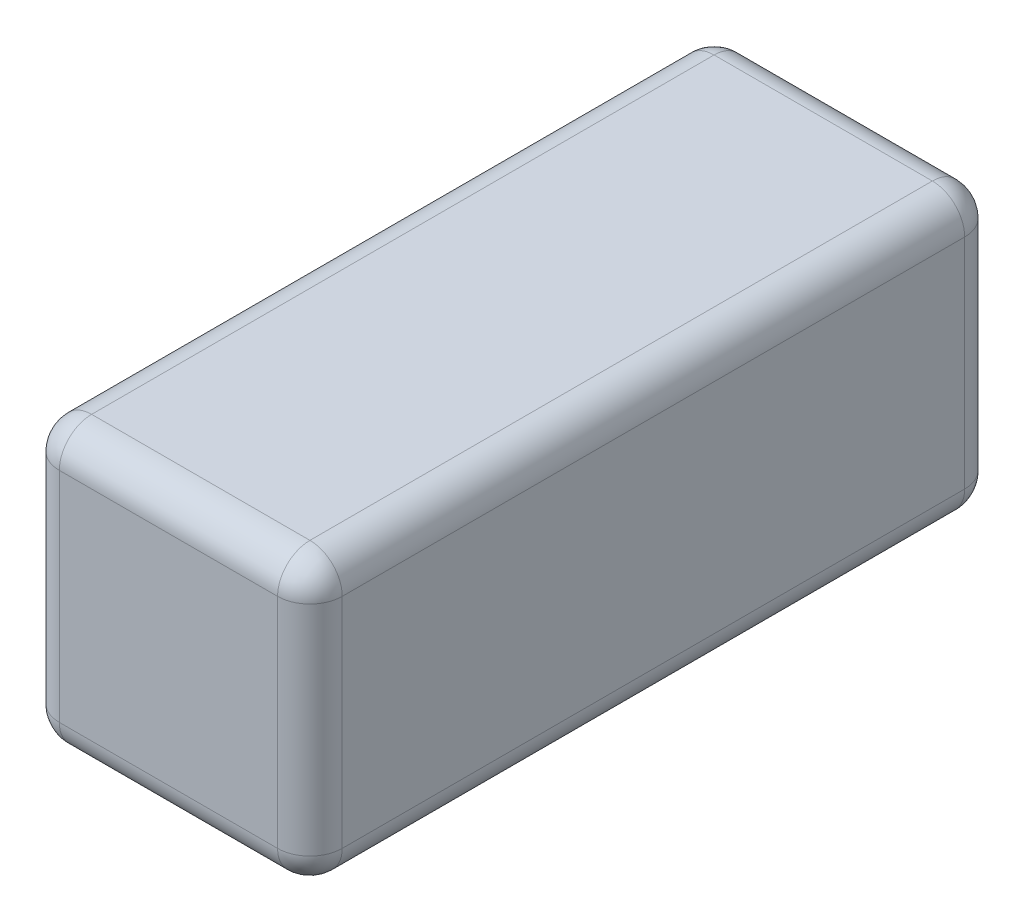
ISO-10303-21;
HEADER;
FILE_DESCRIPTION(('STEP AP214'),'2;1');
FILE_NAME('part.step','',(''),(''),'','','');
FILE_SCHEMA(('AUTOMOTIVE_DESIGN { 1 0 10303 214 1 1 1 1 }'));
ENDSEC;
DATA;
#1=APPLICATION_CONTEXT('core data for automotive mechanical design processes');
#2=APPLICATION_PROTOCOL_DEFINITION('international standard','automotive_design',2000,#1);
#3=PRODUCT_CONTEXT('',#1,'mechanical');
#4=PRODUCT('Part','Part','',(#3));
#5=PRODUCT_RELATED_PRODUCT_CATEGORY('part','',(#4));
#6=PRODUCT_DEFINITION_FORMATION('','',#4);
#7=PRODUCT_DEFINITION_CONTEXT('part definition',#1,'design');
#8=PRODUCT_DEFINITION('design','',#6,#7);
#9=PRODUCT_DEFINITION_SHAPE('','',#8);
#10=(LENGTH_UNIT() NAMED_UNIT(*) SI_UNIT(.MILLI.,.METRE.));
#11=(NAMED_UNIT(*) PLANE_ANGLE_UNIT() SI_UNIT($,.RADIAN.));
#12=(NAMED_UNIT(*) SI_UNIT($,.STERADIAN.) SOLID_ANGLE_UNIT());
#13=UNCERTAINTY_MEASURE_WITH_UNIT(LENGTH_MEASURE(1.E-05),#10,'distance_accuracy_value','');
#14=(GEOMETRIC_REPRESENTATION_CONTEXT(3) GLOBAL_UNCERTAINTY_ASSIGNED_CONTEXT((#13)) GLOBAL_UNIT_ASSIGNED_CONTEXT((#10,
#11,#12)) REPRESENTATION_CONTEXT('',''));
#15=CARTESIAN_POINT('',(0.,0.,0.));
#16=DIRECTION('',(0.,0.,1.));
#17=DIRECTION('',(1.,0.,0.));
#18=AXIS2_PLACEMENT_3D('',#15,#16,#17);
#19=CARTESIAN_POINT('',(35.,-35.,170.));
#20=DIRECTION('',(-1.,0.,0.));
#21=DIRECTION('',(0.,0.,1.));
#22=AXIS2_PLACEMENT_3D('',#19,#20,#21);
#23=PLANE('',#22);
#24=DIRECTION('',(0.,0.,-1.));
#25=VECTOR('',#24,1.);
#26=CARTESIAN_POINT('',(35.,27.,170.));
#27=LINE('',#26,#25);
#28=CARTESIAN_POINT('',(35.,27.,8.00000000000001));
#29=VERTEX_POINT('',#28);
#30=CARTESIAN_POINT('',(35.,27.,162.));
#31=VERTEX_POINT('',#30);
#32=EDGE_CURVE('E209',#29,#31,#27,.F.);
#33=ORIENTED_EDGE('',*,*,#32,.T.);
#34=DIRECTION('',(0.,1.,0.));
#35=VECTOR('',#34,1.);
#36=CARTESIAN_POINT('',(35.,-35.,162.));
#37=LINE('',#36,#35);
#38=CARTESIAN_POINT('',(35.,-27.,162.));
#39=VERTEX_POINT('',#38);
#40=EDGE_CURVE('E215',#31,#39,#37,.F.);
#41=ORIENTED_EDGE('',*,*,#40,.T.);
#42=DIRECTION('',(0.,0.,-1.));
#43=VECTOR('',#42,1.);
#44=CARTESIAN_POINT('',(35.,-27.,170.));
#45=LINE('',#44,#43);
#46=CARTESIAN_POINT('',(35.,-27.,8.00000000000001));
#47=VERTEX_POINT('',#46);
#48=EDGE_CURVE('E212',#39,#47,#45,.T.);
#49=ORIENTED_EDGE('',*,*,#48,.T.);
#50=DIRECTION('',(0.,1.,0.));
#51=VECTOR('',#50,1.);
#52=CARTESIAN_POINT('',(35.,35.,8.00000000000001));
#53=LINE('',#52,#51);
#54=EDGE_CURVE('E206',#47,#29,#53,.T.);
#55=ORIENTED_EDGE('',*,*,#54,.T.);
#56=EDGE_LOOP('',(#33,#41,#49,#55));
#57=FACE_BOUND('',#56,.T.);
#58=ADVANCED_FACE('F43',(#57),#23,.F.);
#59=CARTESIAN_POINT('',(-35.,35.,170.));
#60=DIRECTION('',(0.,-1.,0.));
#61=DIRECTION('',(0.,0.,-1.));
#62=AXIS2_PLACEMENT_3D('',#59,#60,#61);
#63=PLANE('',#62);
#64=DIRECTION('',(-1.,0.,0.));
#65=VECTOR('',#64,1.);
#66=CARTESIAN_POINT('',(-35.,35.,162.));
#67=LINE('',#66,#65);
#68=CARTESIAN_POINT('',(-27.,35.,162.));
#69=VERTEX_POINT('',#68);
#70=CARTESIAN_POINT('',(27.,35.,162.));
#71=VERTEX_POINT('',#70);
#72=EDGE_CURVE('E53',#69,#71,#67,.F.);
#73=ORIENTED_EDGE('',*,*,#72,.T.);
#74=DIRECTION('',(0.,0.,-1.));
#75=VECTOR('',#74,1.);
#76=CARTESIAN_POINT('',(27.,35.,170.));
#77=LINE('',#76,#75);
#78=CARTESIAN_POINT('',(27.,35.,8.00000000000001));
#79=VERTEX_POINT('',#78);
#80=EDGE_CURVE('E11',#71,#79,#77,.T.);
#81=ORIENTED_EDGE('',*,*,#80,.T.);
#82=DIRECTION('',(-1.,0.,0.));
#83=VECTOR('',#82,1.);
#84=CARTESIAN_POINT('',(-35.,35.,8.00000000000001));
#85=LINE('',#84,#83);
#86=CARTESIAN_POINT('',(-27.,35.,8.00000000000001));
#87=VERTEX_POINT('',#86);
#88=EDGE_CURVE('E232',#79,#87,#85,.T.);
#89=ORIENTED_EDGE('',*,*,#88,.T.);
#90=DIRECTION('',(0.,0.,-1.));
#91=VECTOR('',#90,1.);
#92=CARTESIAN_POINT('',(-27.,35.,170.));
#93=LINE('',#92,#91);
#94=EDGE_CURVE('E64',#87,#69,#93,.F.);
#95=ORIENTED_EDGE('',*,*,#94,.T.);
#96=EDGE_LOOP('',(#73,#81,#89,#95));
#97=FACE_BOUND('',#96,.T.);
#98=ADVANCED_FACE('F345',(#97),#63,.F.);
#99=CARTESIAN_POINT('',(-35.,-35.,170.));
#100=DIRECTION('',(1.,0.,0.));
#101=DIRECTION('',(0.,0.,-1.));
#102=AXIS2_PLACEMENT_3D('',#99,#100,#101);
#103=PLANE('',#102);
#104=DIRECTION('',(0.,-1.,0.));
#105=VECTOR('',#104,1.);
#106=CARTESIAN_POINT('',(-35.,-35.,8.00000000000001));
#107=LINE('',#106,#105);
#108=CARTESIAN_POINT('',(-35.,27.,8.00000000000001));
#109=VERTEX_POINT('',#108);
#110=CARTESIAN_POINT('',(-35.,-27.,8.00000000000001));
#111=VERTEX_POINT('',#110);
#112=EDGE_CURVE('E144',#109,#111,#107,.T.);
#113=ORIENTED_EDGE('',*,*,#112,.T.);
#114=DIRECTION('',(0.,0.,-1.));
#115=VECTOR('',#114,1.);
#116=CARTESIAN_POINT('',(-35.,-27.,170.));
#117=LINE('',#116,#115);
#118=CARTESIAN_POINT('',(-35.,-27.,162.));
#119=VERTEX_POINT('',#118);
#120=EDGE_CURVE('E139',#111,#119,#117,.F.);
#121=ORIENTED_EDGE('',*,*,#120,.T.);
#122=DIRECTION('',(0.,-1.,0.));
#123=VECTOR('',#122,1.);
#124=CARTESIAN_POINT('',(-35.,-35.,162.));
#125=LINE('',#124,#123);
#126=CARTESIAN_POINT('',(-35.,27.,162.));
#127=VERTEX_POINT('',#126);
#128=EDGE_CURVE('E131',#119,#127,#125,.F.);
#129=ORIENTED_EDGE('',*,*,#128,.T.);
#130=DIRECTION('',(0.,0.,-1.));
#131=VECTOR('',#130,1.);
#132=CARTESIAN_POINT('',(-35.,27.,170.));
#133=LINE('',#132,#131);
#134=EDGE_CURVE('E136',#127,#109,#133,.T.);
#135=ORIENTED_EDGE('',*,*,#134,.T.);
#136=EDGE_LOOP('',(#113,#121,#129,#135));
#137=FACE_BOUND('',#136,.T.);
#138=ADVANCED_FACE('F134',(#137),#103,.F.);
#139=CARTESIAN_POINT('',(-35.,-35.,170.));
#140=DIRECTION('',(0.,1.,0.));
#141=DIRECTION('',(0.,0.,1.));
#142=AXIS2_PLACEMENT_3D('',#139,#140,#141);
#143=PLANE('',#142);
#144=DIRECTION('',(1.,0.,0.));
#145=VECTOR('',#144,1.);
#146=CARTESIAN_POINT('',(-35.,-35.,162.));
#147=LINE('',#146,#145);
#148=CARTESIAN_POINT('',(27.,-35.,162.));
#149=VERTEX_POINT('',#148);
#150=CARTESIAN_POINT('',(-27.,-35.,162.));
#151=VERTEX_POINT('',#150);
#152=EDGE_CURVE('E225',#149,#151,#147,.F.);
#153=ORIENTED_EDGE('',*,*,#152,.T.);
#154=DIRECTION('',(0.,0.,-1.));
#155=VECTOR('',#154,1.);
#156=CARTESIAN_POINT('',(-27.,-35.,170.));
#157=LINE('',#156,#155);
#158=CARTESIAN_POINT('',(-27.,-35.,8.00000000000001));
#159=VERTEX_POINT('',#158);
#160=EDGE_CURVE('E228',#151,#159,#157,.T.);
#161=ORIENTED_EDGE('',*,*,#160,.T.);
#162=DIRECTION('',(1.,0.,0.));
#163=VECTOR('',#162,1.);
#164=CARTESIAN_POINT('',(35.,-35.,8.00000000000001));
#165=LINE('',#164,#163);
#166=CARTESIAN_POINT('',(27.,-35.,8.00000000000001));
#167=VERTEX_POINT('',#166);
#168=EDGE_CURVE('E219',#159,#167,#165,.T.);
#169=ORIENTED_EDGE('',*,*,#168,.T.);
#170=DIRECTION('',(0.,0.,-1.));
#171=VECTOR('',#170,1.);
#172=CARTESIAN_POINT('',(27.,-35.,170.));
#173=LINE('',#172,#171);
#174=EDGE_CURVE('E222',#167,#149,#173,.F.);
#175=ORIENTED_EDGE('',*,*,#174,.T.);
#176=EDGE_LOOP('',(#153,#161,#169,#175));
#177=FACE_BOUND('',#176,.T.);
#178=ADVANCED_FACE('F322',(#177),#143,.F.);
#179=CARTESIAN_POINT('',(0.,0.,170.));
#180=DIRECTION('',(0.,0.,-1.));
#181=DIRECTION('',(-1.,0.,0.));
#182=AXIS2_PLACEMENT_3D('',#179,#180,#181);
#183=PLANE('',#182);
#184=DIRECTION('',(0.,-1.,0.));
#185=VECTOR('',#184,1.);
#186=CARTESIAN_POINT('',(-27.,0.,170.));
#187=LINE('',#186,#185);
#188=CARTESIAN_POINT('',(-27.,27.,170.));
#189=VERTEX_POINT('',#188);
#190=CARTESIAN_POINT('',(-27.,-27.,170.));
#191=VERTEX_POINT('',#190);
#192=EDGE_CURVE('E152',#189,#191,#187,.T.);
#193=ORIENTED_EDGE('',*,*,#192,.T.);
#194=DIRECTION('',(1.,0.,0.));
#195=VECTOR('',#194,1.);
#196=CARTESIAN_POINT('',(0.,-27.,170.));
#197=LINE('',#196,#195);
#198=CARTESIAN_POINT('',(27.,-27.,170.));
#199=VERTEX_POINT('',#198);
#200=EDGE_CURVE('E203',#191,#199,#197,.T.);
#201=ORIENTED_EDGE('',*,*,#200,.T.);
#202=DIRECTION('',(0.,1.,0.));
#203=VECTOR('',#202,1.);
#204=CARTESIAN_POINT('',(27.,0.,170.));
#205=LINE('',#204,#203);
#206=CARTESIAN_POINT('',(27.,27.,170.));
#207=VERTEX_POINT('',#206);
#208=EDGE_CURVE('E198',#199,#207,#205,.T.);
#209=ORIENTED_EDGE('',*,*,#208,.T.);
#210=DIRECTION('',(-1.,0.,0.));
#211=VECTOR('',#210,1.);
#212=CARTESIAN_POINT('',(0.,27.,170.));
#213=LINE('',#212,#211);
#214=EDGE_CURVE('E195',#207,#189,#213,.T.);
#215=ORIENTED_EDGE('',*,*,#214,.T.);
#216=EDGE_LOOP('',(#193,#201,#209,#215));
#217=FACE_BOUND('',#216,.T.);
#218=ADVANCED_FACE('F575',(#217),#183,.F.);
#219=CARTESIAN_POINT('',(0.,0.,0.));
#220=DIRECTION('',(0.,0.,-1.));
#221=DIRECTION('',(-1.,0.,0.));
#222=AXIS2_PLACEMENT_3D('',#219,#220,#221);
#223=PLANE('',#222);
#224=DIRECTION('',(1.,0.,0.));
#225=VECTOR('',#224,1.);
#226=CARTESIAN_POINT('',(-35.,-27.,0.));
#227=LINE('',#226,#225);
#228=CARTESIAN_POINT('',(27.,-27.,0.));
#229=VERTEX_POINT('',#228);
#230=CARTESIAN_POINT('',(-27.,-27.,0.));
#231=VERTEX_POINT('',#230);
#232=EDGE_CURVE('E188',#229,#231,#227,.F.);
#233=ORIENTED_EDGE('',*,*,#232,.T.);
#234=DIRECTION('',(0.,-1.,0.));
#235=VECTOR('',#234,1.);
#236=CARTESIAN_POINT('',(-27.,35.,0.));
#237=LINE('',#236,#235);
#238=CARTESIAN_POINT('',(-27.,27.,0.));
#239=VERTEX_POINT('',#238);
#240=EDGE_CURVE('E191',#231,#239,#237,.F.);
#241=ORIENTED_EDGE('',*,*,#240,.T.);
#242=DIRECTION('',(-1.,0.,0.));
#243=VECTOR('',#242,1.);
#244=CARTESIAN_POINT('',(35.,27.,0.));
#245=LINE('',#244,#243);
#246=CARTESIAN_POINT('',(27.,27.,0.));
#247=VERTEX_POINT('',#246);
#248=EDGE_CURVE('E185',#239,#247,#245,.F.);
#249=ORIENTED_EDGE('',*,*,#248,.T.);
#250=DIRECTION('',(0.,1.,0.));
#251=VECTOR('',#250,1.);
#252=CARTESIAN_POINT('',(27.,-35.,0.));
#253=LINE('',#252,#251);
#254=EDGE_CURVE('E182',#247,#229,#253,.F.);
#255=ORIENTED_EDGE('',*,*,#254,.T.);
#256=EDGE_LOOP('',(#233,#241,#249,#255));
#257=FACE_BOUND('',#256,.T.);
#258=ADVANCED_FACE('F566',(#257),#223,.T.);
#259=CARTESIAN_POINT('',(27.,0.,162.));
#260=DIRECTION('',(0.,1.,0.));
#261=DIRECTION('',(0.,0.,1.));
#262=AXIS2_PLACEMENT_3D('',#259,#260,#261);
#263=CYLINDRICAL_SURFACE('',#262,8.);
#264=CARTESIAN_POINT('',(27.,27.,162.));
#265=DIRECTION('',(0.,1.,0.));
#266=DIRECTION('',(0.,0.,1.));
#267=AXIS2_PLACEMENT_3D('',#264,#265,#266);
#268=CIRCLE('',#267,8.);
#269=EDGE_CURVE('E47',#207,#31,#268,.T.);
#270=ORIENTED_EDGE('',*,*,#269,.F.);
#271=ORIENTED_EDGE('',*,*,#208,.F.);
#272=CARTESIAN_POINT('',(27.,-27.,162.));
#273=DIRECTION('',(0.,-1.,0.));
#274=DIRECTION('',(0.,0.,-1.));
#275=AXIS2_PLACEMENT_3D('',#272,#273,#274);
#276=CIRCLE('',#275,8.);
#277=EDGE_CURVE('E176',#39,#199,#276,.T.);
#278=ORIENTED_EDGE('',*,*,#277,.F.);
#279=ORIENTED_EDGE('',*,*,#40,.F.);
#280=EDGE_LOOP('',(#270,#271,#278,#279));
#281=FACE_BOUND('',#280,.T.);
#282=ADVANCED_FACE('F45',(#281),#263,.T.);
#283=CARTESIAN_POINT('',(27.,27.,162.));
#284=DIRECTION('',(1.,0.,0.));
#285=DIRECTION('',(0.,0.,-1.));
#286=AXIS2_PLACEMENT_3D('',#283,#284,#285);
#287=SPHERICAL_SURFACE('',#286,8.);
#288=CARTESIAN_POINT('',(27.,27.,162.));
#289=DIRECTION('',(1.,0.,0.));
#290=DIRECTION('',(0.,0.,-1.));
#291=AXIS2_PLACEMENT_3D('',#288,#289,#290);
#292=CIRCLE('',#291,8.);
#293=EDGE_CURVE('E299',#207,#71,#292,.F.);
#294=ORIENTED_EDGE('',*,*,#293,.F.);
#295=ORIENTED_EDGE('',*,*,#269,.T.);
#296=CARTESIAN_POINT('',(27.,27.,162.));
#297=DIRECTION('',(0.,0.,1.));
#298=DIRECTION('',(1.,0.,0.));
#299=AXIS2_PLACEMENT_3D('',#296,#297,#298);
#300=CIRCLE('',#299,8.);
#301=EDGE_CURVE('E302',#71,#31,#300,.F.);
#302=ORIENTED_EDGE('',*,*,#301,.F.);
#303=EDGE_LOOP('',(#294,#295,#302));
#304=FACE_BOUND('',#303,.T.);
#305=ADVANCED_FACE('F547',(#304),#287,.T.);
#306=CARTESIAN_POINT('',(27.,-27.,162.));
#307=DIRECTION('',(0.,0.,1.));
#308=DIRECTION('',(1.,0.,0.));
#309=AXIS2_PLACEMENT_3D('',#306,#307,#308);
#310=SPHERICAL_SURFACE('',#309,8.);
#311=CARTESIAN_POINT('',(27.,-27.,162.));
#312=DIRECTION('',(0.,0.,1.));
#313=DIRECTION('',(1.,0.,0.));
#314=AXIS2_PLACEMENT_3D('',#311,#312,#313);
#315=CIRCLE('',#314,8.);
#316=EDGE_CURVE('E291',#39,#149,#315,.F.);
#317=ORIENTED_EDGE('',*,*,#316,.F.);
#318=ORIENTED_EDGE('',*,*,#277,.T.);
#319=CARTESIAN_POINT('',(27.,-27.,162.));
#320=DIRECTION('',(1.,0.,0.));
#321=DIRECTION('',(0.,0.,-1.));
#322=AXIS2_PLACEMENT_3D('',#319,#320,#321);
#323=CIRCLE('',#322,8.);
#324=EDGE_CURVE('E295',#149,#199,#323,.F.);
#325=ORIENTED_EDGE('',*,*,#324,.F.);
#326=EDGE_LOOP('',(#317,#318,#325));
#327=FACE_BOUND('',#326,.T.);
#328=ADVANCED_FACE('F311',(#327),#310,.T.);
#329=CARTESIAN_POINT('',(27.,27.,170.));
#330=DIRECTION('',(0.,0.,-1.));
#331=DIRECTION('',(-1.,0.,0.));
#332=AXIS2_PLACEMENT_3D('',#329,#330,#331);
#333=CYLINDRICAL_SURFACE('',#332,8.);
#334=ORIENTED_EDGE('',*,*,#301,.T.);
#335=ORIENTED_EDGE('',*,*,#32,.F.);
#336=CARTESIAN_POINT('',(27.,27.,8.00000000000001));
#337=DIRECTION('',(0.,0.,-1.));
#338=DIRECTION('',(-1.,0.,0.));
#339=AXIS2_PLACEMENT_3D('',#336,#337,#338);
#340=CIRCLE('',#339,8.);
#341=EDGE_CURVE('E283',#79,#29,#340,.T.);
#342=ORIENTED_EDGE('',*,*,#341,.F.);
#343=ORIENTED_EDGE('',*,*,#80,.F.);
#344=EDGE_LOOP('',(#334,#335,#342,#343));
#345=FACE_BOUND('',#344,.T.);
#346=ADVANCED_FACE('F344',(#345),#333,.T.);
#347=CARTESIAN_POINT('',(0.,27.,162.));
#348=DIRECTION('',(-1.,0.,0.));
#349=DIRECTION('',(0.,0.,1.));
#350=AXIS2_PLACEMENT_3D('',#347,#348,#349);
#351=CYLINDRICAL_SURFACE('',#350,8.);
#352=ORIENTED_EDGE('',*,*,#293,.T.);
#353=ORIENTED_EDGE('',*,*,#72,.F.);
#354=CARTESIAN_POINT('',(-27.,27.,162.));
#355=DIRECTION('',(-1.,0.,0.));
#356=DIRECTION('',(0.,0.,1.));
#357=AXIS2_PLACEMENT_3D('',#354,#355,#356);
#358=CIRCLE('',#357,8.);
#359=EDGE_CURVE('E157',#189,#69,#358,.T.);
#360=ORIENTED_EDGE('',*,*,#359,.F.);
#361=ORIENTED_EDGE('',*,*,#214,.F.);
#362=EDGE_LOOP('',(#352,#353,#360,#361));
#363=FACE_BOUND('',#362,.T.);
#364=ADVANCED_FACE('F518',(#363),#351,.T.);
#365=CARTESIAN_POINT('',(-27.,0.,162.));
#366=DIRECTION('',(0.,-1.,0.));
#367=DIRECTION('',(0.,0.,-1.));
#368=AXIS2_PLACEMENT_3D('',#365,#366,#367);
#369=CYLINDRICAL_SURFACE('',#368,8.);
#370=CARTESIAN_POINT('',(-27.,-27.,162.));
#371=DIRECTION('',(0.,-1.,0.));
#372=DIRECTION('',(0.,0.,-1.));
#373=AXIS2_PLACEMENT_3D('',#370,#371,#372);
#374=CIRCLE('',#373,8.);
#375=EDGE_CURVE('E158',#191,#119,#374,.T.);
#376=ORIENTED_EDGE('',*,*,#375,.F.);
#377=ORIENTED_EDGE('',*,*,#192,.F.);
#378=CARTESIAN_POINT('',(-27.,27.,162.));
#379=DIRECTION('',(0.,1.,0.));
#380=DIRECTION('',(0.,0.,1.));
#381=AXIS2_PLACEMENT_3D('',#378,#379,#380);
#382=CIRCLE('',#381,8.);
#383=EDGE_CURVE('E148',#127,#189,#382,.T.);
#384=ORIENTED_EDGE('',*,*,#383,.F.);
#385=ORIENTED_EDGE('',*,*,#128,.F.);
#386=EDGE_LOOP('',(#376,#377,#384,#385));
#387=FACE_BOUND('',#386,.T.);
#388=ADVANCED_FACE('F150',(#387),#369,.T.);
#389=CARTESIAN_POINT('',(0.,-27.,162.));
#390=DIRECTION('',(1.,0.,0.));
#391=DIRECTION('',(0.,0.,-1.));
#392=AXIS2_PLACEMENT_3D('',#389,#390,#391);
#393=CYLINDRICAL_SURFACE('',#392,8.);
#394=ORIENTED_EDGE('',*,*,#324,.T.);
#395=ORIENTED_EDGE('',*,*,#200,.F.);
#396=CARTESIAN_POINT('',(-27.,-27.,162.));
#397=DIRECTION('',(-1.,0.,0.));
#398=DIRECTION('',(0.,0.,1.));
#399=AXIS2_PLACEMENT_3D('',#396,#397,#398);
#400=CIRCLE('',#399,8.);
#401=EDGE_CURVE('E276',#151,#191,#400,.T.);
#402=ORIENTED_EDGE('',*,*,#401,.F.);
#403=ORIENTED_EDGE('',*,*,#152,.F.);
#404=EDGE_LOOP('',(#394,#395,#402,#403));
#405=FACE_BOUND('',#404,.T.);
#406=ADVANCED_FACE('F318',(#405),#393,.T.);
#407=CARTESIAN_POINT('',(27.,-27.,170.));
#408=DIRECTION('',(0.,0.,-1.));
#409=DIRECTION('',(-1.,0.,0.));
#410=AXIS2_PLACEMENT_3D('',#407,#408,#409);
#411=CYLINDRICAL_SURFACE('',#410,8.);
#412=ORIENTED_EDGE('',*,*,#316,.T.);
#413=ORIENTED_EDGE('',*,*,#174,.F.);
#414=CARTESIAN_POINT('',(27.,-27.,8.00000000000001));
#415=DIRECTION('',(0.,0.,-1.));
#416=DIRECTION('',(-1.,0.,0.));
#417=AXIS2_PLACEMENT_3D('',#414,#415,#416);
#418=CIRCLE('',#417,8.);
#419=EDGE_CURVE('E272',#47,#167,#418,.T.);
#420=ORIENTED_EDGE('',*,*,#419,.F.);
#421=ORIENTED_EDGE('',*,*,#48,.F.);
#422=EDGE_LOOP('',(#412,#413,#420,#421));
#423=FACE_BOUND('',#422,.T.);
#424=ADVANCED_FACE('F328',(#423),#411,.T.);
#425=CARTESIAN_POINT('',(27.,-35.,8.00000000000001));
#426=DIRECTION('',(0.,-1.,0.));
#427=DIRECTION('',(0.,0.,-1.));
#428=AXIS2_PLACEMENT_3D('',#425,#426,#427);
#429=CYLINDRICAL_SURFACE('',#428,8.);
#430=CARTESIAN_POINT('',(27.,27.,8.00000000000001));
#431=DIRECTION('',(0.,1.,0.));
#432=DIRECTION('',(0.,0.,1.));
#433=AXIS2_PLACEMENT_3D('',#430,#431,#432);
#434=CIRCLE('',#433,8.);
#435=EDGE_CURVE('E287',#29,#247,#434,.T.);
#436=ORIENTED_EDGE('',*,*,#435,.F.);
#437=ORIENTED_EDGE('',*,*,#54,.F.);
#438=CARTESIAN_POINT('',(27.,-27.,8.));
#439=DIRECTION('',(0.,-1.,0.));
#440=DIRECTION('',(0.,0.,-1.));
#441=AXIS2_PLACEMENT_3D('',#438,#439,#440);
#442=CIRCLE('',#441,8.);
#443=EDGE_CURVE('E268',#229,#47,#442,.T.);
#444=ORIENTED_EDGE('',*,*,#443,.F.);
#445=ORIENTED_EDGE('',*,*,#254,.F.);
#446=EDGE_LOOP('',(#436,#437,#444,#445));
#447=FACE_BOUND('',#446,.T.);
#448=ADVANCED_FACE('F335',(#447),#429,.T.);
#449=CARTESIAN_POINT('',(27.,27.,8.));
#450=DIRECTION('',(1.,0.,0.));
#451=DIRECTION('',(0.,0.,-1.));
#452=AXIS2_PLACEMENT_3D('',#449,#450,#451);
#453=SPHERICAL_SURFACE('',#452,8.);
#454=ORIENTED_EDGE('',*,*,#341,.T.);
#455=ORIENTED_EDGE('',*,*,#435,.T.);
#456=CARTESIAN_POINT('',(27.,27.,8.));
#457=DIRECTION('',(1.,0.,0.));
#458=DIRECTION('',(0.,0.,-1.));
#459=AXIS2_PLACEMENT_3D('',#456,#457,#458);
#460=CIRCLE('',#459,8.);
#461=EDGE_CURVE('E165',#79,#247,#460,.F.);
#462=ORIENTED_EDGE('',*,*,#461,.F.);
#463=EDGE_LOOP('',(#454,#455,#462));
#464=FACE_BOUND('',#463,.T.);
#465=ADVANCED_FACE('F341',(#464),#453,.T.);
#466=CARTESIAN_POINT('',(-27.,27.,162.));
#467=DIRECTION('',(0.,0.,1.));
#468=DIRECTION('',(1.,0.,0.));
#469=AXIS2_PLACEMENT_3D('',#466,#467,#468);
#470=SPHERICAL_SURFACE('',#469,8.);
#471=ORIENTED_EDGE('',*,*,#383,.T.);
#472=ORIENTED_EDGE('',*,*,#359,.T.);
#473=CARTESIAN_POINT('',(-27.,27.,162.));
#474=DIRECTION('',(0.,0.,1.));
#475=DIRECTION('',(1.,0.,0.));
#476=AXIS2_PLACEMENT_3D('',#473,#474,#475);
#477=CIRCLE('',#476,8.);
#478=EDGE_CURVE('E161',#127,#69,#477,.F.);
#479=ORIENTED_EDGE('',*,*,#478,.F.);
#480=EDGE_LOOP('',(#471,#472,#479));
#481=FACE_BOUND('',#480,.T.);
#482=ADVANCED_FACE('F162',(#481),#470,.T.);
#483=CARTESIAN_POINT('',(-27.,-27.,162.));
#484=DIRECTION('',(0.,0.,1.));
#485=DIRECTION('',(1.,0.,0.));
#486=AXIS2_PLACEMENT_3D('',#483,#484,#485);
#487=SPHERICAL_SURFACE('',#486,8.);
#488=ORIENTED_EDGE('',*,*,#401,.T.);
#489=ORIENTED_EDGE('',*,*,#375,.T.);
#490=CARTESIAN_POINT('',(-27.,-27.,162.));
#491=DIRECTION('',(0.,0.,1.));
#492=DIRECTION('',(1.,0.,0.));
#493=AXIS2_PLACEMENT_3D('',#490,#491,#492);
#494=CIRCLE('',#493,8.);
#495=EDGE_CURVE('E166',#151,#119,#494,.F.);
#496=ORIENTED_EDGE('',*,*,#495,.F.);
#497=EDGE_LOOP('',(#488,#489,#496));
#498=FACE_BOUND('',#497,.T.);
#499=ADVANCED_FACE('F364',(#498),#487,.T.);
#500=CARTESIAN_POINT('',(27.,-27.,8.));
#501=DIRECTION('',(1.,0.,0.));
#502=DIRECTION('',(0.,0.,-1.));
#503=AXIS2_PLACEMENT_3D('',#500,#501,#502);
#504=SPHERICAL_SURFACE('',#503,8.);
#505=ORIENTED_EDGE('',*,*,#443,.T.);
#506=ORIENTED_EDGE('',*,*,#419,.T.);
#507=CARTESIAN_POINT('',(27.,-27.,8.00000000000001));
#508=DIRECTION('',(1.,0.,0.));
#509=DIRECTION('',(0.,0.,-1.));
#510=AXIS2_PLACEMENT_3D('',#507,#508,#509);
#511=CIRCLE('',#510,8.);
#512=EDGE_CURVE('E258',#229,#167,#511,.F.);
#513=ORIENTED_EDGE('',*,*,#512,.F.);
#514=EDGE_LOOP('',(#505,#506,#513));
#515=FACE_BOUND('',#514,.T.);
#516=ADVANCED_FACE('F366',(#515),#504,.T.);
#517=CARTESIAN_POINT('',(-35.,27.,8.00000000000001));
#518=DIRECTION('',(1.,0.,0.));
#519=DIRECTION('',(0.,0.,-1.));
#520=AXIS2_PLACEMENT_3D('',#517,#518,#519);
#521=CYLINDRICAL_SURFACE('',#520,8.);
#522=ORIENTED_EDGE('',*,*,#461,.T.);
#523=ORIENTED_EDGE('',*,*,#248,.F.);
#524=CARTESIAN_POINT('',(-27.,27.,8.00000000000001));
#525=DIRECTION('',(-1.,0.,0.));
#526=DIRECTION('',(0.,0.,1.));
#527=AXIS2_PLACEMENT_3D('',#524,#525,#526);
#528=CIRCLE('',#527,8.);
#529=EDGE_CURVE('E254',#87,#239,#528,.T.);
#530=ORIENTED_EDGE('',*,*,#529,.F.);
#531=ORIENTED_EDGE('',*,*,#88,.F.);
#532=EDGE_LOOP('',(#522,#523,#530,#531));
#533=FACE_BOUND('',#532,.T.);
#534=ADVANCED_FACE('F349',(#533),#521,.T.);
#535=CARTESIAN_POINT('',(-27.,27.,170.));
#536=DIRECTION('',(0.,0.,-1.));
#537=DIRECTION('',(-1.,0.,0.));
#538=AXIS2_PLACEMENT_3D('',#535,#536,#537);
#539=CYLINDRICAL_SURFACE('',#538,8.);
#540=ORIENTED_EDGE('',*,*,#478,.T.);
#541=ORIENTED_EDGE('',*,*,#94,.F.);
#542=CARTESIAN_POINT('',(-27.,27.,8.00000000000001));
#543=DIRECTION('',(0.,0.,-1.));
#544=DIRECTION('',(-1.,0.,0.));
#545=AXIS2_PLACEMENT_3D('',#542,#543,#544);
#546=CIRCLE('',#545,8.);
#547=EDGE_CURVE('E170',#109,#87,#546,.T.);
#548=ORIENTED_EDGE('',*,*,#547,.F.);
#549=ORIENTED_EDGE('',*,*,#134,.F.);
#550=EDGE_LOOP('',(#540,#541,#548,#549));
#551=FACE_BOUND('',#550,.T.);
#552=ADVANCED_FACE('F168',(#551),#539,.T.);
#553=CARTESIAN_POINT('',(-27.,-27.,170.));
#554=DIRECTION('',(0.,0.,-1.));
#555=DIRECTION('',(-1.,0.,0.));
#556=AXIS2_PLACEMENT_3D('',#553,#554,#555);
#557=CYLINDRICAL_SURFACE('',#556,8.);
#558=ORIENTED_EDGE('',*,*,#495,.T.);
#559=ORIENTED_EDGE('',*,*,#120,.F.);
#560=CARTESIAN_POINT('',(-27.,-27.,8.00000000000001));
#561=DIRECTION('',(0.,0.,-1.));
#562=DIRECTION('',(-1.,0.,0.));
#563=AXIS2_PLACEMENT_3D('',#560,#561,#562);
#564=CIRCLE('',#563,8.);
#565=EDGE_CURVE('E248',#159,#111,#564,.T.);
#566=ORIENTED_EDGE('',*,*,#565,.F.);
#567=ORIENTED_EDGE('',*,*,#160,.F.);
#568=EDGE_LOOP('',(#558,#559,#566,#567));
#569=FACE_BOUND('',#568,.T.);
#570=ADVANCED_FACE('F362',(#569),#557,.T.);
#571=CARTESIAN_POINT('',(-35.,-27.,8.00000000000001));
#572=DIRECTION('',(-1.,0.,0.));
#573=DIRECTION('',(0.,0.,1.));
#574=AXIS2_PLACEMENT_3D('',#571,#572,#573);
#575=CYLINDRICAL_SURFACE('',#574,8.);
#576=ORIENTED_EDGE('',*,*,#512,.T.);
#577=ORIENTED_EDGE('',*,*,#168,.F.);
#578=CARTESIAN_POINT('',(-27.,-27.,8.));
#579=DIRECTION('',(-1.,0.,0.));
#580=DIRECTION('',(0.,0.,1.));
#581=AXIS2_PLACEMENT_3D('',#578,#579,#580);
#582=CIRCLE('',#581,8.);
#583=EDGE_CURVE('E245',#231,#159,#582,.T.);
#584=ORIENTED_EDGE('',*,*,#583,.F.);
#585=ORIENTED_EDGE('',*,*,#232,.F.);
#586=EDGE_LOOP('',(#576,#577,#584,#585));
#587=FACE_BOUND('',#586,.T.);
#588=ADVANCED_FACE('F389',(#587),#575,.T.);
#589=CARTESIAN_POINT('',(-27.,27.,8.));
#590=DIRECTION('',(0.,1.,0.));
#591=DIRECTION('',(0.,0.,1.));
#592=AXIS2_PLACEMENT_3D('',#589,#590,#591);
#593=SPHERICAL_SURFACE('',#592,8.);
#594=ORIENTED_EDGE('',*,*,#547,.T.);
#595=ORIENTED_EDGE('',*,*,#529,.T.);
#596=CARTESIAN_POINT('',(-27.,27.,8.));
#597=DIRECTION('',(0.,1.,0.));
#598=DIRECTION('',(0.,0.,1.));
#599=AXIS2_PLACEMENT_3D('',#596,#597,#598);
#600=CIRCLE('',#599,8.);
#601=EDGE_CURVE('E242',#109,#239,#600,.F.);
#602=ORIENTED_EDGE('',*,*,#601,.F.);
#603=EDGE_LOOP('',(#594,#595,#602));
#604=FACE_BOUND('',#603,.T.);
#605=ADVANCED_FACE('F351',(#604),#593,.T.);
#606=CARTESIAN_POINT('',(-27.,-27.,8.));
#607=DIRECTION('',(0.,-1.,0.));
#608=DIRECTION('',(0.,0.,-1.));
#609=AXIS2_PLACEMENT_3D('',#606,#607,#608);
#610=SPHERICAL_SURFACE('',#609,8.);
#611=ORIENTED_EDGE('',*,*,#583,.T.);
#612=ORIENTED_EDGE('',*,*,#565,.T.);
#613=CARTESIAN_POINT('',(-27.,-27.,8.00000000000001));
#614=DIRECTION('',(0.,-1.,0.));
#615=DIRECTION('',(0.,0.,-1.));
#616=AXIS2_PLACEMENT_3D('',#613,#614,#615);
#617=CIRCLE('',#616,8.);
#618=EDGE_CURVE('E239',#231,#111,#617,.F.);
#619=ORIENTED_EDGE('',*,*,#618,.F.);
#620=EDGE_LOOP('',(#611,#612,#619));
#621=FACE_BOUND('',#620,.T.);
#622=ADVANCED_FACE('F359',(#621),#610,.T.);
#623=CARTESIAN_POINT('',(-27.,-35.,8.00000000000001));
#624=DIRECTION('',(0.,1.,0.));
#625=DIRECTION('',(0.,0.,1.));
#626=AXIS2_PLACEMENT_3D('',#623,#624,#625);
#627=CYLINDRICAL_SURFACE('',#626,8.);
#628=ORIENTED_EDGE('',*,*,#601,.T.);
#629=ORIENTED_EDGE('',*,*,#240,.F.);
#630=ORIENTED_EDGE('',*,*,#618,.T.);
#631=ORIENTED_EDGE('',*,*,#112,.F.);
#632=EDGE_LOOP('',(#628,#629,#630,#631));
#633=FACE_BOUND('',#632,.T.);
#634=ADVANCED_FACE('F355',(#633),#627,.T.);
#635=CLOSED_SHELL('',(#58,#98,#138,#178,#218,#258,#282,#305,#328,#346,#364,#388,#406,#424,#448,
#465,#482,#499,#516,#534,#552,#570,#588,#605,#622,#634));
#636=MANIFOLD_SOLID_BREP('B2',#635);
#637=ADVANCED_BREP_SHAPE_REPRESENTATION('',(#18,#636),#14);
#638=SHAPE_DEFINITION_REPRESENTATION(#9,#637);
ENDSEC;
END-ISO-10303-21;
